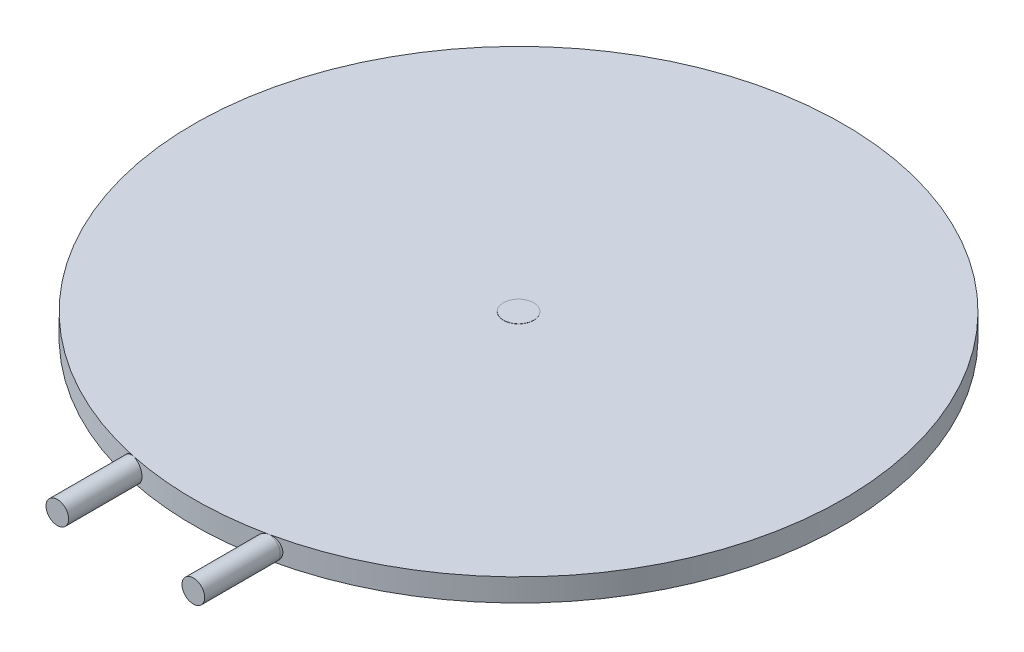
ISO-10303-21;
HEADER;
FILE_DESCRIPTION(('STEP AP214'),'2;1');
FILE_NAME('part.step','',(''),(''),'','','');
FILE_SCHEMA(('AUTOMOTIVE_DESIGN { 1 0 10303 214 1 1 1 1 }'));
ENDSEC;
DATA;
#1=APPLICATION_CONTEXT('core data for automotive mechanical design processes');
#2=APPLICATION_PROTOCOL_DEFINITION('international standard','automotive_design',2000,#1);
#3=PRODUCT_CONTEXT('',#1,'mechanical');
#4=PRODUCT('Part','Part','',(#3));
#5=PRODUCT_RELATED_PRODUCT_CATEGORY('part','',(#4));
#6=PRODUCT_DEFINITION_FORMATION('','',#4);
#7=PRODUCT_DEFINITION_CONTEXT('part definition',#1,'design');
#8=PRODUCT_DEFINITION('design','',#6,#7);
#9=PRODUCT_DEFINITION_SHAPE('','',#8);
#10=(LENGTH_UNIT() NAMED_UNIT(*) SI_UNIT(.MILLI.,.METRE.));
#11=(NAMED_UNIT(*) PLANE_ANGLE_UNIT() SI_UNIT($,.RADIAN.));
#12=(NAMED_UNIT(*) SI_UNIT($,.STERADIAN.) SOLID_ANGLE_UNIT());
#13=UNCERTAINTY_MEASURE_WITH_UNIT(LENGTH_MEASURE(1.E-05),#10,'distance_accuracy_value','');
#14=(GEOMETRIC_REPRESENTATION_CONTEXT(3) GLOBAL_UNCERTAINTY_ASSIGNED_CONTEXT((#13)) GLOBAL_UNIT_ASSIGNED_CONTEXT((#10,
#11,#12)) REPRESENTATION_CONTEXT('',''));
#15=CARTESIAN_POINT('',(0.,0.,0.));
#16=DIRECTION('',(0.,0.,1.));
#17=DIRECTION('',(1.,0.,0.));
#18=AXIS2_PLACEMENT_3D('',#15,#16,#17);
#19=CARTESIAN_POINT('',(0.,1.5,0.));
#20=DIRECTION('',(0.,-1.,0.));
#21=DIRECTION('',(0.,0.,-1.));
#22=AXIS2_PLACEMENT_3D('',#19,#20,#21);
#23=CYLINDRICAL_SURFACE('',#22,21.5);
#24=CARTESIAN_POINT('',(4.49999999999998,0.,21.0237960416286));
#25=CARTESIAN_POINT('',(4.54309599035681,-3.12189765004901E-05,21.0145769641035));
#26=CARTESIAN_POINT('',(4.58615176379055,0.00371259477568913,21.0052174173752));
#27=CARTESIAN_POINT('',(4.67098802159358,0.018492041784423,20.9865122805541));
#28=CARTESIAN_POINT('',(4.71276876785445,0.0295261669143333,20.9771666879753));
#29=CARTESIAN_POINT('',(4.79389989239935,0.0586357146453578,20.9587755454207));
#30=CARTESIAN_POINT('',(4.83324900279107,0.0767147752860602,20.9497301530929));
#31=CARTESIAN_POINT('',(4.90835000673582,0.119432890333853,20.9322617855163));
#32=CARTESIAN_POINT('',(4.94410294532577,0.144070031349275,20.9238386296375));
#33=CARTESIAN_POINT('',(5.01070611110562,0.19906361384736,20.9079886871601));
#34=CARTESIAN_POINT('',(5.04159014588703,0.229377098250795,20.9005550912735));
#35=CARTESIAN_POINT('',(5.09780244496416,0.295028455327898,20.8869157329957));
#36=CARTESIAN_POINT('',(5.12313058870124,0.330366437001945,20.8807099972486));
#37=CARTESIAN_POINT('',(5.16684348348711,0.40414809518478,20.8699359114168));
#38=CARTESIAN_POINT('',(5.18538238218339,0.442495116151193,20.8653313486106));
#39=CARTESIAN_POINT('',(5.21573871763585,0.521912068291206,20.8577639329079));
#40=CARTESIAN_POINT('',(5.22755775368723,0.56298134897977,20.8548006893896));
#41=CARTESIAN_POINT('',(5.24383601681599,0.645468120185463,20.8507134847387));
#42=CARTESIAN_POINT('',(5.24848795508687,0.686845265347042,20.8495413705191));
#43=CARTESIAN_POINT('',(5.25088567879963,0.769810691528025,20.8489376581087));
#44=CARTESIAN_POINT('',(5.24863203320854,0.81139895487105,20.8495059165246));
#45=CARTESIAN_POINT('',(5.23737571993154,0.893005721097742,20.8523362662375));
#46=CARTESIAN_POINT('',(5.22846613112136,0.933037936237821,20.8545749966047));
#47=CARTESIAN_POINT('',(5.2043005146961,1.01101131625643,20.8606186397255));
#48=CARTESIAN_POINT('',(5.1890443525562,1.04895243679187,20.8644235856774));
#49=CARTESIAN_POINT('',(5.1525163346286,1.12202821797704,20.8734743315488));
#50=CARTESIAN_POINT('',(5.13119548415629,1.15713690239673,20.8787318560293));
#51=CARTESIAN_POINT('',(5.08324242394352,1.22328377400262,20.8904584428453));
#52=CARTESIAN_POINT('',(5.05660988709479,1.25432171030572,20.8969275797937));
#53=CARTESIAN_POINT('',(4.99808608758662,1.31226977409682,20.9110033579807));
#54=CARTESIAN_POINT('',(4.96608177231486,1.33905985381752,20.9186340264807));
#55=CARTESIAN_POINT('',(4.89819652702389,1.38691853988885,20.9346336312715));
#56=CARTESIAN_POINT('',(4.86231380828293,1.40798449039403,20.9430029078794));
#57=CARTESIAN_POINT('',(4.78663608748113,1.44437099224581,20.9604309258515));
#58=CARTESIAN_POINT('',(4.74676100400282,1.45951892645376,20.9695022543403));
#59=CARTESIAN_POINT('',(4.66511227766252,1.48282652882765,20.9878170281003));
#60=CARTESIAN_POINT('',(4.6233414371918,1.49099617963321,20.9970602081127));
#61=CARTESIAN_POINT('',(4.55423082522181,1.49853221919402,21.0121338080055));
#62=CARTESIAN_POINT('',(4.52711469523012,1.50000998808323,21.0179938016022));
#63=CARTESIAN_POINT('',(4.49999999999998,1.5,21.0237960416286));
#64=B_SPLINE_CURVE_WITH_KNOTS('',3,(#24,#25,#26,#27,#28,#29,#30,#31,#32,#33,#34,#35,#36,#37,#38,
#39,#40,#41,#42,#43,#44,#45,#46,#47,#48,#49,#50,#51,#52,#53,#54,#55,#56,#57,#58,#59,#60,#61,#62,
#63),.UNSPECIFIED.,.F.,.F.,(4,2,2,2,2,2,2,2,2,2,2,2,2,2,2,2,2,2,2,4),(0.,0.132041013603476,
0.264054720794907,0.396136691055711,0.528180167115971,0.65926204421801,0.79034676541648,
0.918237423265085,1.04609763099369,1.17045588459905,1.29480389231561,1.41744478516836,
1.54008827770502,1.66375216796522,1.78742367614111,1.91413139465827,2.04089780222927,
2.17112617357585,2.30116793590784,2.38435043594938),.UNSPECIFIED.);
#65=CARTESIAN_POINT('',(4.5,0.,21.0237960416286));
#66=VERTEX_POINT('',#65);
#67=CARTESIAN_POINT('',(4.5,1.5,21.0237960416286));
#68=VERTEX_POINT('',#67);
#69=EDGE_CURVE('E240',#66,#68,#64,.T.);
#70=ORIENTED_EDGE('',*,*,#69,.F.);
#71=CARTESIAN_POINT('',(0.,0.,0.));
#72=DIRECTION('',(0.,1.,0.));
#73=DIRECTION('',(0.,0.,1.));
#74=AXIS2_PLACEMENT_3D('',#71,#72,#73);
#75=CIRCLE('',#74,21.5);
#76=CARTESIAN_POINT('',(-4.5,0.,21.0237960416286));
#77=VERTEX_POINT('',#76);
#78=EDGE_CURVE('E223',#66,#77,#75,.T.);
#79=ORIENTED_EDGE('',*,*,#78,.T.);
#80=CARTESIAN_POINT('',(-4.49999999999997,1.5,21.0237960416286));
#81=CARTESIAN_POINT('',(-4.54309599035679,1.5000312189765,21.0145769641035));
#82=CARTESIAN_POINT('',(-4.58615176379053,1.49628740522431,21.0052174173752));
#83=CARTESIAN_POINT('',(-4.67098802159356,1.48150795821558,20.9865122805541));
#84=CARTESIAN_POINT('',(-4.71276876785443,1.47047383308567,20.9771666879753));
#85=CARTESIAN_POINT('',(-4.79389989239933,1.44136428535464,20.9587755454207));
#86=CARTESIAN_POINT('',(-4.83324900279105,1.42328522471394,20.9497301530929));
#87=CARTESIAN_POINT('',(-4.9083500067358,1.38056710966615,20.9322617855163));
#88=CARTESIAN_POINT('',(-4.94410294532576,1.35592996865073,20.9238386296375));
#89=CARTESIAN_POINT('',(-5.0107061111056,1.30093638615264,20.9079886871601));
#90=CARTESIAN_POINT('',(-5.04159014588701,1.27062290174921,20.9005550912735));
#91=CARTESIAN_POINT('',(-5.09780244496415,1.20497154467211,20.8869157329957));
#92=CARTESIAN_POINT('',(-5.12313058870123,1.16963356299806,20.8807099972486));
#93=CARTESIAN_POINT('',(-5.16684348348709,1.09585190481522,20.8699359114169));
#94=CARTESIAN_POINT('',(-5.18538238218337,1.05750488384881,20.8653313486106));
#95=CARTESIAN_POINT('',(-5.21573871763583,0.978087931708798,20.8577639329079));
#96=CARTESIAN_POINT('',(-5.22755775368721,0.937018651020234,20.8548006893896));
#97=CARTESIAN_POINT('',(-5.24383601681597,0.854531879814541,20.8507134847387));
#98=CARTESIAN_POINT('',(-5.24848795508686,0.813154734652962,20.8495413705191));
#99=CARTESIAN_POINT('',(-5.25088567879962,0.730189308471979,20.8489376581087));
#100=CARTESIAN_POINT('',(-5.24863203320853,0.688601045128954,20.8495059165246));
#101=CARTESIAN_POINT('',(-5.23737571993153,0.606994278902262,20.8523362662376));
#102=CARTESIAN_POINT('',(-5.22846613112135,0.566962063762183,20.8545749966047));
#103=CARTESIAN_POINT('',(-5.20430051469609,0.488988683743575,20.8606186397255));
#104=CARTESIAN_POINT('',(-5.18904435255619,0.451047563208132,20.8644235856774));
#105=CARTESIAN_POINT('',(-5.15251633462858,0.377971782022968,20.8734743315488));
#106=CARTESIAN_POINT('',(-5.13119548415628,0.342863097603274,20.8787318560293));
#107=CARTESIAN_POINT('',(-5.08324242394351,0.276716225997379,20.8904584428453));
#108=CARTESIAN_POINT('',(-5.05660988709478,0.245678289694279,20.8969275797937));
#109=CARTESIAN_POINT('',(-4.99808608758661,0.187730225903186,20.9110033579807));
#110=CARTESIAN_POINT('',(-4.96608177231485,0.160940146182482,20.9186340264807));
#111=CARTESIAN_POINT('',(-4.89819652702387,0.113081460111156,20.9346336312715));
#112=CARTESIAN_POINT('',(-4.86231380828292,0.0920155096059754,20.9430029078794));
#113=CARTESIAN_POINT('',(-4.78663608748112,0.0556290077541879,20.9604309258515));
#114=CARTESIAN_POINT('',(-4.74676100400281,0.0404810735462392,20.9695022543403));
#115=CARTESIAN_POINT('',(-4.66511227766251,0.0171734711723463,20.9878170281003));
#116=CARTESIAN_POINT('',(-4.62334143719179,0.00900382036678839,20.9970602081127));
#117=CARTESIAN_POINT('',(-4.5542308252218,0.00146778080597738,21.0121338080055));
#118=CARTESIAN_POINT('',(-4.5271146952301,-9.98808322761038E-06,21.0179938016022));
#119=CARTESIAN_POINT('',(-4.49999999999997,0.,21.0237960416286));
#120=B_SPLINE_CURVE_WITH_KNOTS('',3,(#80,#81,#82,#83,#84,#85,#86,#87,#88,#89,#90,#91,#92,#93,
#94,#95,#96,#97,#98,#99,#100,#101,#102,#103,#104,#105,#106,#107,#108,#109,#110,#111,#112,#113,
#114,#115,#116,#117,#118,#119),.UNSPECIFIED.,.F.,.F.,(4,2,2,2,2,2,2,2,2,2,2,2,2,2,2,2,2,2,2,4),
(0.,0.132041013603477,0.264054720794907,0.396136691055712,0.52818016711597,0.659262044218009,
0.79034676541648,0.918237423265085,1.04609763099369,1.17045588459905,1.29480389231561,
1.41744478516836,1.54008827770502,1.66375216796522,1.78742367614111,1.91413139465827,
2.04089780222927,2.17112617357585,2.30116793590784,2.38435043594939),.UNSPECIFIED.);
#121=CARTESIAN_POINT('',(-4.5,1.5,21.0237960416286));
#122=VERTEX_POINT('',#121);
#123=EDGE_CURVE('E238',#122,#77,#120,.T.);
#124=ORIENTED_EDGE('',*,*,#123,.F.);
#125=CARTESIAN_POINT('',(0.,1.5,0.));
#126=DIRECTION('',(0.,1.,0.));
#127=DIRECTION('',(0.,0.,1.));
#128=AXIS2_PLACEMENT_3D('',#125,#126,#127);
#129=CIRCLE('',#128,21.5);
#130=EDGE_CURVE('E236',#68,#122,#129,.T.);
#131=ORIENTED_EDGE('',*,*,#130,.F.);
#132=EDGE_LOOP('',(#70,#79,#124,#131));
#133=FACE_BOUND('',#132,.T.);
#134=ADVANCED_FACE('F199',(#133),#23,.T.);
#135=CARTESIAN_POINT('',(4.49999999999999,1.5,21.0237960416286));
#136=CARTESIAN_POINT('',(4.45733002538746,1.50003383210664,21.0329345187231));
#137=CARTESIAN_POINT('',(4.41463108014706,1.49636015536159,21.0419329583925));
#138=CARTESIAN_POINT('',(4.33037360471578,1.48180674628155,21.0594315452355));
#139=CARTESIAN_POINT('',(4.28881509092774,1.47092691035667,21.0679316852441));
#140=CARTESIAN_POINT('',(4.20800485605894,1.44215831032888,21.0842218874725));
#141=CARTESIAN_POINT('',(4.16875506365664,1.42426377924507,21.0920113589193));
#142=CARTESIAN_POINT('',(4.09378872643988,1.38193618243121,21.1066896889612));
#143=CARTESIAN_POINT('',(4.05807064536703,1.35750597694236,21.1135789395661));
#144=CARTESIAN_POINT('',(3.9916785631267,1.30310753577605,21.1262309294973));
#145=CARTESIAN_POINT('',(3.96094633306644,1.27321346931266,21.1320068482598));
#146=CARTESIAN_POINT('',(3.90493689185368,1.20850906807423,21.1424284654479));
#147=CARTESIAN_POINT('',(3.87966021751753,1.17369825005722,21.1470740526567));
#148=CARTESIAN_POINT('',(3.83577765548233,1.10083434224725,21.1550774117222));
#149=CARTESIAN_POINT('',(3.817059205029,1.06285142207053,21.1584569910168));
#150=CARTESIAN_POINT('',(3.78625553291085,0.984204588666365,21.1639910123641));
#151=CARTESIAN_POINT('',(3.77416930590928,0.943541082819272,21.1661456401011));
#152=CARTESIAN_POINT('',(3.75712447265067,0.861257760449235,21.1691778382353));
#153=CARTESIAN_POINT('',(3.75207470726179,0.819657408743327,21.1700717434922));
#154=CARTESIAN_POINT('',(3.74896521946049,0.736187901946237,21.1706226299001));
#155=CARTESIAN_POINT('',(3.750905360921,0.694318752105696,21.1702796351393));
#156=CARTESIAN_POINT('',(3.761685323373,0.611739047661224,21.1683667912523));
#157=CARTESIAN_POINT('',(3.77048778633793,0.571023453141296,21.1668035848195));
#158=CARTESIAN_POINT('',(3.79467472009036,0.491665025125336,21.1624807967258));
#159=CARTESIAN_POINT('',(3.81005916964188,0.453022184942264,21.1597212189249));
#160=CARTESIAN_POINT('',(3.84699447931004,0.378774916949365,21.1530372518945));
#161=CARTESIAN_POINT('',(3.86856321035113,0.34317968873582,21.1491094856672));
#162=CARTESIAN_POINT('',(3.91719677045185,0.276126734712522,21.1401556004534));
#163=CARTESIAN_POINT('',(3.9442615607922,0.244668979757184,21.1351294892045));
#164=CARTESIAN_POINT('',(4.00340178427436,0.186412053205605,21.1240073620371));
#165=CARTESIAN_POINT('',(4.0355272904266,0.15966579862253,21.1179005696032));
#166=CARTESIAN_POINT('',(4.10364949434755,0.111927350092824,21.1047687120135));
#167=CARTESIAN_POINT('',(4.13964764750072,0.0909373299957363,21.0977433014153));
#168=CARTESIAN_POINT('',(4.21512374225799,0.0549280419077075,21.0827948109604));
#169=CARTESIAN_POINT('',(4.25465099700771,0.0400180107319015,21.0748583372483));
#170=CARTESIAN_POINT('',(4.33549537360289,0.0170613357770859,21.0583754022695));
#171=CARTESIAN_POINT('',(4.3768100477079,0.00900559979910468,21.049829765425));
#172=CARTESIAN_POINT('',(4.43197913650776,0.0029655867439773,21.0382450699842));
#173=CARTESIAN_POINT('',(4.44557704669759,0.00185257507264991,21.0353759002241));
#174=CARTESIAN_POINT('',(4.47278246269114,0.000370795165433967,21.0296079184443));
#175=CARTESIAN_POINT('',(4.48638991117694,7.42454112303788E-07,21.0267091663071));
#176=CARTESIAN_POINT('',(4.49999999999999,0.,21.0237960416286));
#177=B_SPLINE_CURVE_WITH_KNOTS('',3,(#135,#136,#137,#138,#139,#140,#141,#142,#143,#144,#145,
#146,#147,#148,#149,#150,#151,#152,#153,#154,#155,#156,#157,#158,#159,#160,#161,#162,#163,#164,
#165,#166,#167,#168,#169,#170,#171,#172,#173,#174,#175,#176),.UNSPECIFIED.,.F.,.F.,(4,2,2,2,2,2,
2,2,2,2,2,2,2,2,2,2,2,2,2,2,4),(0.,0.13075783070761,0.261517541124027,0.392384979047771,
0.523195238198841,0.652346418698106,0.781510301640708,0.908334020021378,1.03513850868326,
1.1602844385387,1.28542793121476,1.40989486817571,1.53436140356198,1.65919130297774,
1.7840203230077,1.91017256431465,2.03637238177938,2.16474906124042,2.29295518280639,
2.33476648234644,2.37650543334939),.UNSPECIFIED.);
#178=EDGE_CURVE('E215',#68,#66,#177,.T.);
#179=ORIENTED_EDGE('',*,*,#178,.F.);
#180=EDGE_CURVE('E208',#122,#68,#129,.T.);
#181=ORIENTED_EDGE('',*,*,#180,.F.);
#182=CARTESIAN_POINT('',(-4.49999999999998,0.,21.0237960416286));
#183=CARTESIAN_POINT('',(-4.45733002538745,-3.38321066368091E-05,21.0329345187231));
#184=CARTESIAN_POINT('',(-4.41463108014706,0.00363984463840541,21.0419329583925));
#185=CARTESIAN_POINT('',(-4.33037360471577,0.0181932537184536,21.0594315452355));
#186=CARTESIAN_POINT('',(-4.28881509092774,0.029073089643331,21.0679316852441));
#187=CARTESIAN_POINT('',(-4.20800485605893,0.0578416896711201,21.0842218874725));
#188=CARTESIAN_POINT('',(-4.16875506365663,0.0757362207549279,21.0920113589193));
#189=CARTESIAN_POINT('',(-4.09378872643987,0.11806381756879,21.1066896889612));
#190=CARTESIAN_POINT('',(-4.05807064536703,0.142494023057638,21.1135789395661));
#191=CARTESIAN_POINT('',(-3.99167856312669,0.196892464223947,21.1262309294973));
#192=CARTESIAN_POINT('',(-3.96094633306643,0.226786530687344,21.1320068482598));
#193=CARTESIAN_POINT('',(-3.90493689185368,0.291490931925771,21.1424284654479));
#194=CARTESIAN_POINT('',(-3.87966021751752,0.326301749942781,21.1470740526567));
#195=CARTESIAN_POINT('',(-3.83577765548233,0.399165657752751,21.1550774117222));
#196=CARTESIAN_POINT('',(-3.81705920502899,0.437148577929476,21.1584569910168));
#197=CARTESIAN_POINT('',(-3.78625553291085,0.515795411333636,21.1639910123641));
#198=CARTESIAN_POINT('',(-3.77416930590927,0.55645891718073,21.1661456401011));
#199=CARTESIAN_POINT('',(-3.75712447265067,0.638742239550766,21.1691778382353));
#200=CARTESIAN_POINT('',(-3.75207470726178,0.680342591256674,21.1700717434922));
#201=CARTESIAN_POINT('',(-3.74896521946048,0.763812098053765,21.1706226299001));
#202=CARTESIAN_POINT('',(-3.75090536092099,0.805681247894306,21.1702796351393));
#203=CARTESIAN_POINT('',(-3.761685323373,0.888260952338777,21.1683667912523));
#204=CARTESIAN_POINT('',(-3.77048778633792,0.928976546858705,21.1668035848195));
#205=CARTESIAN_POINT('',(-3.79467472009036,1.00833497487466,21.1624807967258));
#206=CARTESIAN_POINT('',(-3.81005916964187,1.04697781505774,21.1597212189249));
#207=CARTESIAN_POINT('',(-3.84699447931003,1.12122508305064,21.1530372518945));
#208=CARTESIAN_POINT('',(-3.86856321035113,1.15682031126418,21.1491094856672));
#209=CARTESIAN_POINT('',(-3.91719677045185,1.22387326528748,21.1401556004534));
#210=CARTESIAN_POINT('',(-3.94426156079219,1.25533102024282,21.1351294892045));
#211=CARTESIAN_POINT('',(-4.00340178427436,1.3135879467944,21.1240073620371));
#212=CARTESIAN_POINT('',(-4.03552729042659,1.34033420137747,21.1179005696032));
#213=CARTESIAN_POINT('',(-4.10364949434755,1.38807264990718,21.1047687120135));
#214=CARTESIAN_POINT('',(-4.13964764750072,1.40906267000426,21.0977433014153));
#215=CARTESIAN_POINT('',(-4.21512374225799,1.44507195809229,21.0827948109604));
#216=CARTESIAN_POINT('',(-4.25465099700771,1.4599819892681,21.0748583372483));
#217=CARTESIAN_POINT('',(-4.33549537360288,1.48293866422291,21.0583754022695));
#218=CARTESIAN_POINT('',(-4.3768100477079,1.4909944002009,21.049829765425));
#219=CARTESIAN_POINT('',(-4.43197913650776,1.49703441325602,21.0382450699842));
#220=CARTESIAN_POINT('',(-4.44557704669759,1.49814742492735,21.0353759002241));
#221=CARTESIAN_POINT('',(-4.47278246269113,1.49962920483457,21.0296079184443));
#222=CARTESIAN_POINT('',(-4.48638991117694,1.49999925754589,21.0267091663071));
#223=CARTESIAN_POINT('',(-4.49999999999998,1.5,21.0237960416286));
#224=B_SPLINE_CURVE_WITH_KNOTS('',3,(#182,#183,#184,#185,#186,#187,#188,#189,#190,#191,#192,
#193,#194,#195,#196,#197,#198,#199,#200,#201,#202,#203,#204,#205,#206,#207,#208,#209,#210,#211,
#212,#213,#214,#215,#216,#217,#218,#219,#220,#221,#222,#223),.UNSPECIFIED.,.F.,.F.,(4,2,2,2,2,2,
2,2,2,2,2,2,2,2,2,2,2,2,2,2,4),(0.,0.13075783070761,0.261517541124026,0.392384979047769,
0.523195238198839,0.652346418698105,0.781510301640706,0.908334020021376,1.03513850868326,
1.1602844385387,1.28542793121476,1.40989486817571,1.53436140356198,1.65919130297773,
1.7840203230077,1.91017256431465,2.03637238177937,2.16474906124042,2.29295518280639,
2.33476648234644,2.37650543334939),.UNSPECIFIED.);
#225=EDGE_CURVE('E233',#77,#122,#224,.T.);
#226=ORIENTED_EDGE('',*,*,#225,.F.);
#227=EDGE_CURVE('E230',#77,#66,#75,.T.);
#228=ORIENTED_EDGE('',*,*,#227,.T.);
#229=EDGE_LOOP('',(#179,#181,#226,#228));
#230=FACE_BOUND('',#229,.T.);
#231=ADVANCED_FACE('F231',(#230),#23,.T.);
#232=CARTESIAN_POINT('',(0.,1.5,0.));
#233=DIRECTION('',(0.,1.,0.));
#234=DIRECTION('',(0.,0.,1.));
#235=AXIS2_PLACEMENT_3D('',#232,#233,#234);
#236=PLANE('',#235);
#237=CARTESIAN_POINT('',(0.,1.5,0.));
#238=DIRECTION('',(0.,1.,0.));
#239=DIRECTION('',(0.,0.,1.));
#240=AXIS2_PLACEMENT_3D('',#237,#238,#239);
#241=CIRCLE('',#240,1.);
#242=CARTESIAN_POINT('',(0.,1.5,1.));
#243=VERTEX_POINT('',#242);
#244=EDGE_CURVE('E13',#243,#243,#241,.T.);
#245=ORIENTED_EDGE('',*,*,#244,.F.);
#246=EDGE_LOOP('',(#245));
#247=FACE_BOUND('',#246,.T.);
#248=ORIENTED_EDGE('',*,*,#180,.T.);
#249=ORIENTED_EDGE('',*,*,#130,.T.);
#250=EDGE_LOOP('',(#248,#249));
#251=FACE_BOUND('',#250,.T.);
#252=ADVANCED_FACE('F305',(#247,#251),#236,.T.);
#253=CARTESIAN_POINT('',(0.,0.,0.));
#254=DIRECTION('',(0.,1.,0.));
#255=DIRECTION('',(0.,0.,1.));
#256=AXIS2_PLACEMENT_3D('',#253,#254,#255);
#257=PLANE('',#256);
#258=CARTESIAN_POINT('',(0.,0.,0.));
#259=DIRECTION('',(0.,-1.,0.));
#260=DIRECTION('',(0.,0.,1.));
#261=AXIS2_PLACEMENT_3D('',#258,#259,#260);
#262=CIRCLE('',#261,1.);
#263=CARTESIAN_POINT('',(0.,0.,1.));
#264=VERTEX_POINT('',#263);
#265=EDGE_CURVE('E358',#264,#264,#262,.T.);
#266=ORIENTED_EDGE('',*,*,#265,.F.);
#267=EDGE_LOOP('',(#266));
#268=FACE_BOUND('',#267,.T.);
#269=ORIENTED_EDGE('',*,*,#227,.F.);
#270=ORIENTED_EDGE('',*,*,#78,.F.);
#271=EDGE_LOOP('',(#269,#270));
#272=FACE_BOUND('',#271,.T.);
#273=ADVANCED_FACE('F237',(#268,#272),#257,.F.);
#274=CARTESIAN_POINT('',(-4.49999999999997,0.75,19.0237960416286));
#275=DIRECTION('',(0.,0.,1.));
#276=DIRECTION('',(1.,0.,0.));
#277=AXIS2_PLACEMENT_3D('',#274,#275,#276);
#278=CYLINDRICAL_SURFACE('',#277,0.75);
#279=CARTESIAN_POINT('',(-4.49999999999997,0.75,21.0237960416286));
#280=DIRECTION('',(0.,0.,-1.));
#281=DIRECTION('',(-1.,0.,0.));
#282=AXIS2_PLACEMENT_3D('',#279,#280,#281);
#283=CIRCLE('',#282,0.75);
#284=EDGE_CURVE('E245',#77,#122,#283,.T.);
#285=ORIENTED_EDGE('',*,*,#284,.T.);
#286=ORIENTED_EDGE('',*,*,#123,.T.);
#287=EDGE_LOOP('',(#285,#286));
#288=FACE_BOUND('',#287,.T.);
#289=ADVANCED_FACE('F284',(#288),#278,.T.);
#290=CARTESIAN_POINT('',(-4.5,0.75,21.0237960416286));
#291=DIRECTION('',(0.,0.,1.));
#292=DIRECTION('',(1.,0.,0.));
#293=AXIS2_PLACEMENT_3D('',#290,#291,#292);
#294=CYLINDRICAL_SURFACE('',#293,0.75);
#295=CARTESIAN_POINT('',(-4.49999999999999,0.75,26.0237960416286));
#296=DIRECTION('',(0.,0.,-1.));
#297=DIRECTION('',(-1.,0.,0.));
#298=AXIS2_PLACEMENT_3D('',#295,#296,#297);
#299=CIRCLE('',#298,0.75);
#300=CARTESIAN_POINT('',(-5.24999999999999,0.75,26.0237960416286));
#301=VERTEX_POINT('',#300);
#302=EDGE_CURVE('E309',#301,#301,#299,.T.);
#303=ORIENTED_EDGE('',*,*,#302,.T.);
#304=EDGE_LOOP('',(#303));
#305=FACE_BOUND('',#304,.T.);
#306=ORIENTED_EDGE('',*,*,#284,.F.);
#307=ORIENTED_EDGE('',*,*,#225,.T.);
#308=EDGE_LOOP('',(#306,#307));
#309=FACE_BOUND('',#308,.T.);
#310=ADVANCED_FACE('F288',(#305,#309),#294,.T.);
#311=CARTESIAN_POINT('',(-4.49999999999999,0.75,26.0237960416286));
#312=DIRECTION('',(0.,0.,-1.));
#313=DIRECTION('',(-1.,0.,0.));
#314=AXIS2_PLACEMENT_3D('',#311,#312,#313);
#315=PLANE('',#314);
#316=ORIENTED_EDGE('',*,*,#302,.F.);
#317=EDGE_LOOP('',(#316));
#318=FACE_BOUND('',#317,.T.);
#319=ADVANCED_FACE('F314',(#318),#315,.F.);
#320=CARTESIAN_POINT('',(4.49999999999999,0.75,19.0237960416286));
#321=DIRECTION('',(0.,0.,1.));
#322=DIRECTION('',(1.,0.,0.));
#323=AXIS2_PLACEMENT_3D('',#320,#321,#322);
#324=CYLINDRICAL_SURFACE('',#323,0.75);
#325=CARTESIAN_POINT('',(4.49999999999999,0.75,21.0237960416286));
#326=DIRECTION('',(0.,0.,-1.));
#327=DIRECTION('',(-1.,0.,0.));
#328=AXIS2_PLACEMENT_3D('',#325,#326,#327);
#329=CIRCLE('',#328,0.75);
#330=EDGE_CURVE('E249',#68,#66,#329,.T.);
#331=ORIENTED_EDGE('',*,*,#330,.T.);
#332=ORIENTED_EDGE('',*,*,#69,.T.);
#333=EDGE_LOOP('',(#331,#332));
#334=FACE_BOUND('',#333,.T.);
#335=ADVANCED_FACE('F252',(#334),#324,.T.);
#336=CARTESIAN_POINT('',(4.5,0.75,21.0237960416286));
#337=DIRECTION('',(0.,0.,1.));
#338=DIRECTION('',(1.,0.,0.));
#339=AXIS2_PLACEMENT_3D('',#336,#337,#338);
#340=CYLINDRICAL_SURFACE('',#339,0.75);
#341=CARTESIAN_POINT('',(4.5,0.75,26.0237960416286));
#342=DIRECTION('',(0.,0.,-1.));
#343=DIRECTION('',(-1.,0.,0.));
#344=AXIS2_PLACEMENT_3D('',#341,#342,#343);
#345=CIRCLE('',#344,0.75);
#346=CARTESIAN_POINT('',(3.75,0.75,26.0237960416286));
#347=VERTEX_POINT('',#346);
#348=EDGE_CURVE('E250',#347,#347,#345,.T.);
#349=ORIENTED_EDGE('',*,*,#348,.T.);
#350=EDGE_LOOP('',(#349));
#351=FACE_BOUND('',#350,.T.);
#352=ORIENTED_EDGE('',*,*,#330,.F.);
#353=ORIENTED_EDGE('',*,*,#178,.T.);
#354=EDGE_LOOP('',(#352,#353));
#355=FACE_BOUND('',#354,.T.);
#356=ADVANCED_FACE('F248',(#351,#355),#340,.T.);
#357=CARTESIAN_POINT('',(4.5,0.75,26.0237960416286));
#358=DIRECTION('',(0.,0.,-1.));
#359=DIRECTION('',(-1.,0.,0.));
#360=AXIS2_PLACEMENT_3D('',#357,#358,#359);
#361=PLANE('',#360);
#362=ORIENTED_EDGE('',*,*,#348,.F.);
#363=EDGE_LOOP('',(#362));
#364=FACE_BOUND('',#363,.T.);
#365=ADVANCED_FACE('F276',(#364),#361,.F.);
#366=CARTESIAN_POINT('',(0.,1.5,0.));
#367=DIRECTION('',(0.,1.,0.));
#368=DIRECTION('',(0.,0.,1.));
#369=AXIS2_PLACEMENT_3D('',#366,#367,#368);
#370=CYLINDRICAL_SURFACE('',#369,1.);
#371=CARTESIAN_POINT('',(0.,1.51,0.));
#372=DIRECTION('',(0.,1.,0.));
#373=DIRECTION('',(0.,0.,1.));
#374=AXIS2_PLACEMENT_3D('',#371,#372,#373);
#375=CIRCLE('',#374,1.);
#376=CARTESIAN_POINT('',(0.,1.51,1.));
#377=VERTEX_POINT('',#376);
#378=EDGE_CURVE('E253',#377,#377,#375,.T.);
#379=ORIENTED_EDGE('',*,*,#378,.F.);
#380=EDGE_LOOP('',(#379));
#381=FACE_BOUND('',#380,.T.);
#382=ORIENTED_EDGE('',*,*,#244,.T.);
#383=EDGE_LOOP('',(#382));
#384=FACE_BOUND('',#383,.T.);
#385=ADVANCED_FACE('F282',(#381,#384),#370,.T.);
#386=CARTESIAN_POINT('',(0.,1.51,0.));
#387=DIRECTION('',(0.,1.,0.));
#388=DIRECTION('',(0.,0.,1.));
#389=AXIS2_PLACEMENT_3D('',#386,#387,#388);
#390=PLANE('',#389);
#391=ORIENTED_EDGE('',*,*,#378,.T.);
#392=EDGE_LOOP('',(#391));
#393=FACE_BOUND('',#392,.T.);
#394=ADVANCED_FACE('F338',(#393),#390,.T.);
#395=CARTESIAN_POINT('',(0.,0.,0.));
#396=DIRECTION('',(0.,1.,0.));
#397=DIRECTION('',(0.,0.,1.));
#398=AXIS2_PLACEMENT_3D('',#395,#396,#397);
#399=CYLINDRICAL_SURFACE('',#398,1.);
#400=CARTESIAN_POINT('',(0.,-0.01,0.));
#401=DIRECTION('',(0.,-1.,0.));
#402=DIRECTION('',(0.,0.,-1.));
#403=AXIS2_PLACEMENT_3D('',#400,#401,#402);
#404=CIRCLE('',#403,1.);
#405=CARTESIAN_POINT('',(0.,-0.01,-1.));
#406=VERTEX_POINT('',#405);
#407=EDGE_CURVE('E259',#406,#406,#404,.T.);
#408=ORIENTED_EDGE('',*,*,#407,.F.);
#409=EDGE_LOOP('',(#408));
#410=FACE_BOUND('',#409,.T.);
#411=ORIENTED_EDGE('',*,*,#265,.T.);
#412=EDGE_LOOP('',(#411));
#413=FACE_BOUND('',#412,.T.);
#414=ADVANCED_FACE('F342',(#410,#413),#399,.T.);
#415=CARTESIAN_POINT('',(0.,-0.01,0.));
#416=DIRECTION('',(0.,1.,0.));
#417=DIRECTION('',(0.,0.,1.));
#418=AXIS2_PLACEMENT_3D('',#415,#416,#417);
#419=PLANE('',#418);
#420=ORIENTED_EDGE('',*,*,#407,.T.);
#421=EDGE_LOOP('',(#420));
#422=FACE_BOUND('',#421,.T.);
#423=ADVANCED_FACE('F349',(#422),#419,.F.);
#424=CLOSED_SHELL('',(#134,#231,#252,#273,#289,#310,#319,#335,#356,#365,#385,#394,#414,#423));
#425=MANIFOLD_SOLID_BREP('B2',#424);
#426=ADVANCED_BREP_SHAPE_REPRESENTATION('',(#18,#425),#14);
#427=SHAPE_DEFINITION_REPRESENTATION(#9,#426);
ENDSEC;
END-ISO-10303-21;
